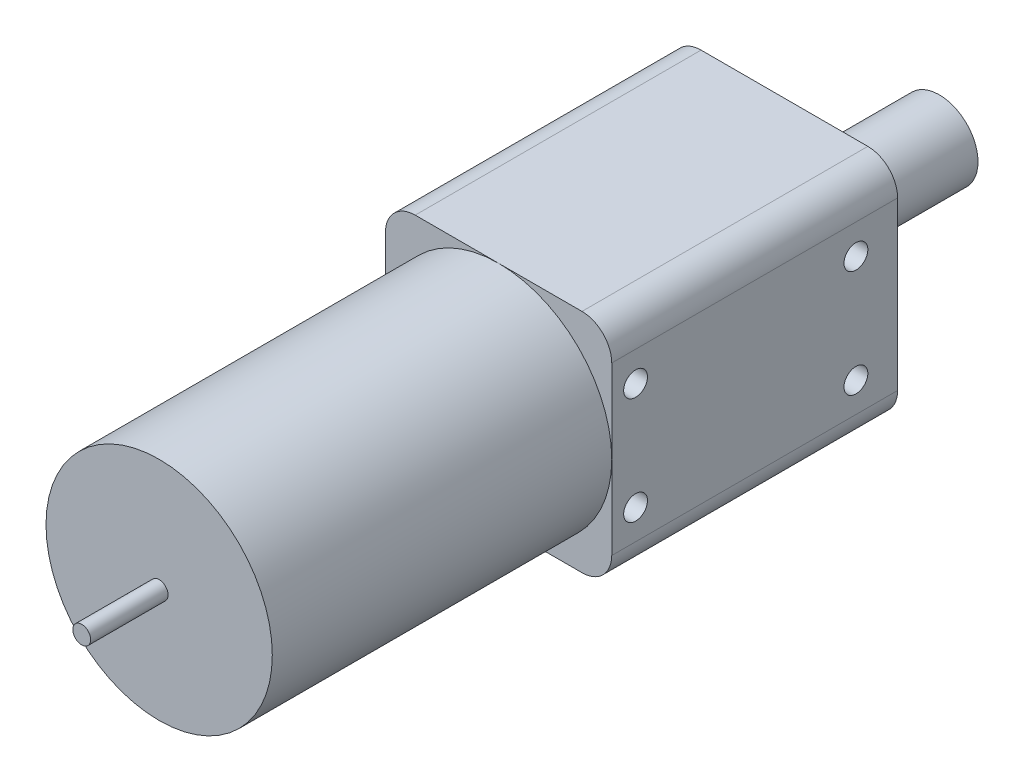
ISO-10303-21;
HEADER;
FILE_DESCRIPTION(('STEP AP214'),'2;1');
FILE_NAME('part.step','',(''),(''),'','','');
FILE_SCHEMA(('AUTOMOTIVE_DESIGN { 1 0 10303 214 1 1 1 1 }'));
ENDSEC;
DATA;
#1=APPLICATION_CONTEXT('core data for automotive mechanical design processes');
#2=APPLICATION_PROTOCOL_DEFINITION('international standard','automotive_design',2000,#1);
#3=PRODUCT_CONTEXT('',#1,'mechanical');
#4=PRODUCT('Part','Part','',(#3));
#5=PRODUCT_RELATED_PRODUCT_CATEGORY('part','',(#4));
#6=PRODUCT_DEFINITION_FORMATION('','',#4);
#7=PRODUCT_DEFINITION_CONTEXT('part definition',#1,'design');
#8=PRODUCT_DEFINITION('design','',#6,#7);
#9=PRODUCT_DEFINITION_SHAPE('','',#8);
#10=(LENGTH_UNIT() NAMED_UNIT(*) SI_UNIT(.MILLI.,.METRE.));
#11=(NAMED_UNIT(*) PLANE_ANGLE_UNIT() SI_UNIT($,.RADIAN.));
#12=(NAMED_UNIT(*) SI_UNIT($,.STERADIAN.) SOLID_ANGLE_UNIT());
#13=UNCERTAINTY_MEASURE_WITH_UNIT(LENGTH_MEASURE(1.E-05),#10,'distance_accuracy_value','');
#14=(GEOMETRIC_REPRESENTATION_CONTEXT(3) GLOBAL_UNCERTAINTY_ASSIGNED_CONTEXT((#13)) GLOBAL_UNIT_ASSIGNED_CONTEXT((#10,
#11,#12)) REPRESENTATION_CONTEXT('',''));
#15=CARTESIAN_POINT('',(0.,0.,0.));
#16=DIRECTION('',(0.,0.,1.));
#17=DIRECTION('',(1.,0.,0.));
#18=AXIS2_PLACEMENT_3D('',#15,#16,#17);
#19=CARTESIAN_POINT('',(0.,0.,57.));
#20=DIRECTION('',(0.,0.,1.));
#21=DIRECTION('',(1.,0.,0.));
#22=AXIS2_PLACEMENT_3D('',#19,#20,#21);
#23=PLANE('',#22);
#24=CARTESIAN_POINT('',(0.,0.,57.));
#25=DIRECTION('',(0.,0.,1.));
#26=DIRECTION('',(1.,0.,0.));
#27=AXIS2_PLACEMENT_3D('',#24,#25,#26);
#28=CIRCLE('',#27,19.);
#29=CARTESIAN_POINT('',(19.,0.,57.));
#30=VERTEX_POINT('',#29);
#31=EDGE_CURVE('E145',#30,#30,#28,.T.);
#32=ORIENTED_EDGE('',*,*,#31,.T.);
#33=EDGE_LOOP('',(#32));
#34=FACE_BOUND('',#33,.T.);
#35=CARTESIAN_POINT('',(0.,0.,57.));
#36=DIRECTION('',(0.,0.,1.));
#37=DIRECTION('',(1.,0.,0.));
#38=AXIS2_PLACEMENT_3D('',#35,#36,#37);
#39=CIRCLE('',#38,1.5);
#40=CARTESIAN_POINT('',(-1.5,0.,57.));
#41=VERTEX_POINT('',#40);
#42=EDGE_CURVE('E217',#41,#41,#39,.T.);
#43=ORIENTED_EDGE('',*,*,#42,.F.);
#44=EDGE_LOOP('',(#43));
#45=FACE_BOUND('',#44,.T.);
#46=ADVANCED_FACE('F32',(#34,#45),#23,.T.);
#47=CARTESIAN_POINT('',(0.,0.,-48.));
#48=DIRECTION('',(0.,0.,-1.));
#49=DIRECTION('',(-1.,0.,0.));
#50=AXIS2_PLACEMENT_3D('',#47,#48,#49);
#51=PLANE('',#50);
#52=DIRECTION('',(-1.,0.,0.));
#53=VECTOR('',#52,1.);
#54=CARTESIAN_POINT('',(19.,-19.,-48.));
#55=LINE('',#54,#53);
#56=CARTESIAN_POINT('',(14.,-19.,-48.));
#57=VERTEX_POINT('',#56);
#58=CARTESIAN_POINT('',(-14.,-19.,-48.));
#59=VERTEX_POINT('',#58);
#60=EDGE_CURVE('E191',#57,#59,#55,.T.);
#61=ORIENTED_EDGE('',*,*,#60,.T.);
#62=CARTESIAN_POINT('',(-14.,-14.,-48.));
#63=DIRECTION('',(0.,0.,-1.));
#64=DIRECTION('',(-1.,0.,0.));
#65=AXIS2_PLACEMENT_3D('',#62,#63,#64);
#66=CIRCLE('',#65,5.);
#67=CARTESIAN_POINT('',(-19.,-14.,-48.));
#68=VERTEX_POINT('',#67);
#69=EDGE_CURVE('E165',#59,#68,#66,.T.);
#70=ORIENTED_EDGE('',*,*,#69,.T.);
#71=DIRECTION('',(0.,1.,0.));
#72=VECTOR('',#71,1.);
#73=CARTESIAN_POINT('',(-19.,19.,-48.));
#74=LINE('',#73,#72);
#75=CARTESIAN_POINT('',(-19.,14.,-48.));
#76=VERTEX_POINT('',#75);
#77=EDGE_CURVE('E201',#68,#76,#74,.T.);
#78=ORIENTED_EDGE('',*,*,#77,.T.);
#79=CARTESIAN_POINT('',(-14.,14.,-48.));
#80=DIRECTION('',(0.,0.,-1.));
#81=DIRECTION('',(-1.,0.,0.));
#82=AXIS2_PLACEMENT_3D('',#79,#80,#81);
#83=CIRCLE('',#82,5.);
#84=CARTESIAN_POINT('',(-14.,19.,-48.));
#85=VERTEX_POINT('',#84);
#86=EDGE_CURVE('E163',#76,#85,#83,.T.);
#87=ORIENTED_EDGE('',*,*,#86,.T.);
#88=DIRECTION('',(1.,0.,0.));
#89=VECTOR('',#88,1.);
#90=CARTESIAN_POINT('',(19.,19.,-48.));
#91=LINE('',#90,#89);
#92=CARTESIAN_POINT('',(14.,19.,-48.));
#93=VERTEX_POINT('',#92);
#94=EDGE_CURVE('E192',#85,#93,#91,.T.);
#95=ORIENTED_EDGE('',*,*,#94,.T.);
#96=CARTESIAN_POINT('',(14.,14.,-48.));
#97=DIRECTION('',(0.,0.,-1.));
#98=DIRECTION('',(-1.,0.,0.));
#99=AXIS2_PLACEMENT_3D('',#96,#97,#98);
#100=CIRCLE('',#99,5.);
#101=CARTESIAN_POINT('',(19.,14.,-48.));
#102=VERTEX_POINT('',#101);
#103=EDGE_CURVE('E159',#93,#102,#100,.T.);
#104=ORIENTED_EDGE('',*,*,#103,.T.);
#105=DIRECTION('',(0.,-1.,0.));
#106=VECTOR('',#105,1.);
#107=CARTESIAN_POINT('',(19.,19.,-48.));
#108=LINE('',#107,#106);
#109=CARTESIAN_POINT('',(19.,-14.,-48.));
#110=VERTEX_POINT('',#109);
#111=EDGE_CURVE('E180',#102,#110,#108,.T.);
#112=ORIENTED_EDGE('',*,*,#111,.T.);
#113=CARTESIAN_POINT('',(14.,-14.,-48.));
#114=DIRECTION('',(0.,0.,-1.));
#115=DIRECTION('',(-1.,0.,0.));
#116=AXIS2_PLACEMENT_3D('',#113,#114,#115);
#117=CIRCLE('',#116,5.);
#118=EDGE_CURVE('E161',#110,#57,#117,.T.);
#119=ORIENTED_EDGE('',*,*,#118,.T.);
#120=EDGE_LOOP('',(#61,#70,#78,#87,#95,#104,#112,#119));
#121=FACE_BOUND('',#120,.T.);
#122=CARTESIAN_POINT('',(0.,0.,-48.));
#123=DIRECTION('',(0.,0.,-1.));
#124=DIRECTION('',(-1.,0.,0.));
#125=AXIS2_PLACEMENT_3D('',#122,#123,#124);
#126=CIRCLE('',#125,6.5);
#127=CARTESIAN_POINT('',(6.5,0.,-48.));
#128=VERTEX_POINT('',#127);
#129=EDGE_CURVE('E211',#128,#128,#126,.T.);
#130=ORIENTED_EDGE('',*,*,#129,.F.);
#131=EDGE_LOOP('',(#130));
#132=FACE_BOUND('',#131,.T.);
#133=ADVANCED_FACE('F186',(#121,#132),#51,.T.);
#134=CARTESIAN_POINT('',(0.,0.,57.));
#135=DIRECTION('',(0.,0.,-1.));
#136=DIRECTION('',(-1.,0.,0.));
#137=AXIS2_PLACEMENT_3D('',#134,#135,#136);
#138=CYLINDRICAL_SURFACE('',#137,19.);
#139=ORIENTED_EDGE('',*,*,#31,.F.);
#140=EDGE_LOOP('',(#139));
#141=FACE_BOUND('',#140,.T.);
#142=CARTESIAN_POINT('',(0.,0.,0.));
#143=DIRECTION('',(0.,0.,1.));
#144=DIRECTION('',(1.,0.,0.));
#145=AXIS2_PLACEMENT_3D('',#142,#143,#144);
#146=CIRCLE('',#145,19.);
#147=CARTESIAN_POINT('',(19.,0.,0.));
#148=VERTEX_POINT('',#147);
#149=CARTESIAN_POINT('',(0.,19.,0.));
#150=VERTEX_POINT('',#149);
#151=EDGE_CURVE('E144',#148,#150,#146,.T.);
#152=ORIENTED_EDGE('',*,*,#151,.T.);
#153=CARTESIAN_POINT('',(-19.,0.,0.));
#154=VERTEX_POINT('',#153);
#155=EDGE_CURVE('E131',#150,#154,#146,.T.);
#156=ORIENTED_EDGE('',*,*,#155,.T.);
#157=CARTESIAN_POINT('',(0.,-19.,0.));
#158=VERTEX_POINT('',#157);
#159=EDGE_CURVE('E124',#154,#158,#146,.T.);
#160=ORIENTED_EDGE('',*,*,#159,.T.);
#161=EDGE_CURVE('E132',#158,#148,#146,.T.);
#162=ORIENTED_EDGE('',*,*,#161,.T.);
#163=EDGE_LOOP('',(#152,#156,#160,#162));
#164=FACE_BOUND('',#163,.T.);
#165=ADVANCED_FACE('F142',(#141,#164),#138,.T.);
#166=CARTESIAN_POINT('',(0.,0.,0.));
#167=DIRECTION('',(0.,0.,-1.));
#168=DIRECTION('',(-1.,0.,0.));
#169=AXIS2_PLACEMENT_3D('',#166,#167,#168);
#170=PLANE('',#169);
#171=DIRECTION('',(0.,-1.,0.));
#172=VECTOR('',#171,1.);
#173=CARTESIAN_POINT('',(19.,19.,0.));
#174=LINE('',#173,#172);
#175=CARTESIAN_POINT('',(19.,14.,0.));
#176=VERTEX_POINT('',#175);
#177=EDGE_CURVE('E204',#176,#148,#174,.T.);
#178=ORIENTED_EDGE('',*,*,#177,.F.);
#179=CARTESIAN_POINT('',(14.,14.,0.));
#180=DIRECTION('',(0.,0.,-1.));
#181=DIRECTION('',(-1.,0.,0.));
#182=AXIS2_PLACEMENT_3D('',#179,#180,#181);
#183=CIRCLE('',#182,5.);
#184=CARTESIAN_POINT('',(14.,19.,0.));
#185=VERTEX_POINT('',#184);
#186=EDGE_CURVE('E11',#176,#185,#183,.F.);
#187=ORIENTED_EDGE('',*,*,#186,.T.);
#188=DIRECTION('',(1.,0.,0.));
#189=VECTOR('',#188,1.);
#190=CARTESIAN_POINT('',(19.,19.,0.));
#191=LINE('',#190,#189);
#192=EDGE_CURVE('E120',#150,#185,#191,.T.);
#193=ORIENTED_EDGE('',*,*,#192,.F.);
#194=ORIENTED_EDGE('',*,*,#151,.F.);
#195=EDGE_LOOP('',(#178,#187,#193,#194));
#196=FACE_BOUND('',#195,.T.);
#197=ADVANCED_FACE('F321',(#196),#170,.F.);
#198=CARTESIAN_POINT('',(-14.,19.,0.));
#199=VERTEX_POINT('',#198);
#200=EDGE_CURVE('E207',#199,#150,#191,.T.);
#201=ORIENTED_EDGE('',*,*,#200,.F.);
#202=CARTESIAN_POINT('',(-14.,14.,0.));
#203=DIRECTION('',(0.,0.,-1.));
#204=DIRECTION('',(-1.,0.,0.));
#205=AXIS2_PLACEMENT_3D('',#202,#203,#204);
#206=CIRCLE('',#205,5.);
#207=CARTESIAN_POINT('',(-19.,14.,0.));
#208=VERTEX_POINT('',#207);
#209=EDGE_CURVE('E139',#199,#208,#206,.F.);
#210=ORIENTED_EDGE('',*,*,#209,.T.);
#211=DIRECTION('',(0.,1.,0.));
#212=VECTOR('',#211,1.);
#213=CARTESIAN_POINT('',(-19.,19.,0.));
#214=LINE('',#213,#212);
#215=EDGE_CURVE('E115',#154,#208,#214,.T.);
#216=ORIENTED_EDGE('',*,*,#215,.F.);
#217=ORIENTED_EDGE('',*,*,#155,.F.);
#218=EDGE_LOOP('',(#201,#210,#216,#217));
#219=FACE_BOUND('',#218,.T.);
#220=ADVANCED_FACE('F137',(#219),#170,.F.);
#221=CARTESIAN_POINT('',(-19.,-14.,0.));
#222=VERTEX_POINT('',#221);
#223=EDGE_CURVE('E110',#222,#154,#214,.T.);
#224=ORIENTED_EDGE('',*,*,#223,.F.);
#225=CARTESIAN_POINT('',(-14.,-14.,0.));
#226=DIRECTION('',(0.,0.,-1.));
#227=DIRECTION('',(-1.,0.,0.));
#228=AXIS2_PLACEMENT_3D('',#225,#226,#227);
#229=CIRCLE('',#228,5.);
#230=CARTESIAN_POINT('',(-14.,-19.,0.));
#231=VERTEX_POINT('',#230);
#232=EDGE_CURVE('E152',#222,#231,#229,.F.);
#233=ORIENTED_EDGE('',*,*,#232,.T.);
#234=DIRECTION('',(-1.,0.,0.));
#235=VECTOR('',#234,1.);
#236=CARTESIAN_POINT('',(19.,-19.,0.));
#237=LINE('',#236,#235);
#238=EDGE_CURVE('E127',#158,#231,#237,.T.);
#239=ORIENTED_EDGE('',*,*,#238,.F.);
#240=ORIENTED_EDGE('',*,*,#159,.F.);
#241=EDGE_LOOP('',(#224,#233,#239,#240));
#242=FACE_BOUND('',#241,.T.);
#243=ADVANCED_FACE('F125',(#242),#170,.F.);
#244=CARTESIAN_POINT('',(-19.,19.,-48.));
#245=DIRECTION('',(1.,0.,0.));
#246=DIRECTION('',(0.,0.,-1.));
#247=AXIS2_PLACEMENT_3D('',#244,#245,#246);
#248=PLANE('',#247);
#249=CARTESIAN_POINT('',(-19.,9.,-41.));
#250=DIRECTION('',(-1.,0.,0.));
#251=DIRECTION('',(0.,0.,1.));
#252=AXIS2_PLACEMENT_3D('',#249,#250,#251);
#253=CIRCLE('',#252,2.);
#254=CARTESIAN_POINT('',(-19.,9.,-39.));
#255=VERTEX_POINT('',#254);
#256=EDGE_CURVE('E241',#255,#255,#253,.T.);
#257=ORIENTED_EDGE('',*,*,#256,.F.);
#258=EDGE_LOOP('',(#257));
#259=FACE_BOUND('',#258,.T.);
#260=CARTESIAN_POINT('',(-19.,-9.,-41.));
#261=DIRECTION('',(-1.,0.,0.));
#262=DIRECTION('',(0.,0.,1.));
#263=AXIS2_PLACEMENT_3D('',#260,#261,#262);
#264=CIRCLE('',#263,2.);
#265=CARTESIAN_POINT('',(-19.,-9.,-39.));
#266=VERTEX_POINT('',#265);
#267=EDGE_CURVE('E235',#266,#266,#264,.T.);
#268=ORIENTED_EDGE('',*,*,#267,.F.);
#269=EDGE_LOOP('',(#268));
#270=FACE_BOUND('',#269,.T.);
#271=CARTESIAN_POINT('',(-19.,-9.,-4.));
#272=DIRECTION('',(-1.,0.,0.));
#273=DIRECTION('',(0.,0.,1.));
#274=AXIS2_PLACEMENT_3D('',#271,#272,#273);
#275=CIRCLE('',#274,2.);
#276=CARTESIAN_POINT('',(-19.,-9.,-2.));
#277=VERTEX_POINT('',#276);
#278=EDGE_CURVE('E229',#277,#277,#275,.T.);
#279=ORIENTED_EDGE('',*,*,#278,.F.);
#280=EDGE_LOOP('',(#279));
#281=FACE_BOUND('',#280,.T.);
#282=CARTESIAN_POINT('',(-19.,9.,-4.));
#283=DIRECTION('',(-1.,0.,0.));
#284=DIRECTION('',(0.,0.,1.));
#285=AXIS2_PLACEMENT_3D('',#282,#283,#284);
#286=CIRCLE('',#285,2.);
#287=CARTESIAN_POINT('',(-19.,9.,-2.));
#288=VERTEX_POINT('',#287);
#289=EDGE_CURVE('E223',#288,#288,#286,.T.);
#290=ORIENTED_EDGE('',*,*,#289,.F.);
#291=EDGE_LOOP('',(#290));
#292=FACE_BOUND('',#291,.T.);
#293=ORIENTED_EDGE('',*,*,#77,.F.);
#294=DIRECTION('',(0.,0.,1.));
#295=VECTOR('',#294,1.);
#296=CARTESIAN_POINT('',(-19.,-14.,-48.));
#297=LINE('',#296,#295);
#298=EDGE_CURVE('E118',#68,#222,#297,.T.);
#299=ORIENTED_EDGE('',*,*,#298,.T.);
#300=ORIENTED_EDGE('',*,*,#223,.T.);
#301=ORIENTED_EDGE('',*,*,#215,.T.);
#302=DIRECTION('',(0.,0.,1.));
#303=VECTOR('',#302,1.);
#304=CARTESIAN_POINT('',(-19.,14.,-48.));
#305=LINE('',#304,#303);
#306=EDGE_CURVE('E149',#208,#76,#305,.F.);
#307=ORIENTED_EDGE('',*,*,#306,.T.);
#308=EDGE_LOOP('',(#293,#299,#300,#301,#307));
#309=FACE_BOUND('',#308,.T.);
#310=ADVANCED_FACE('F113',(#259,#270,#281,#292,#309),#248,.F.);
#311=CARTESIAN_POINT('',(19.,19.,-48.));
#312=DIRECTION('',(0.,-1.,0.));
#313=DIRECTION('',(0.,0.,-1.));
#314=AXIS2_PLACEMENT_3D('',#311,#312,#313);
#315=PLANE('',#314);
#316=ORIENTED_EDGE('',*,*,#94,.F.);
#317=DIRECTION('',(0.,0.,1.));
#318=VECTOR('',#317,1.);
#319=CARTESIAN_POINT('',(-14.,19.,-48.));
#320=LINE('',#319,#318);
#321=EDGE_CURVE('E169',#85,#199,#320,.T.);
#322=ORIENTED_EDGE('',*,*,#321,.T.);
#323=ORIENTED_EDGE('',*,*,#200,.T.);
#324=ORIENTED_EDGE('',*,*,#192,.T.);
#325=DIRECTION('',(0.,0.,1.));
#326=VECTOR('',#325,1.);
#327=CARTESIAN_POINT('',(14.,19.,-48.));
#328=LINE('',#327,#326);
#329=EDGE_CURVE('E167',#185,#93,#328,.F.);
#330=ORIENTED_EDGE('',*,*,#329,.T.);
#331=EDGE_LOOP('',(#316,#322,#323,#324,#330));
#332=FACE_BOUND('',#331,.T.);
#333=ADVANCED_FACE('F282',(#332),#315,.F.);
#334=CARTESIAN_POINT('',(19.,19.,-48.));
#335=DIRECTION('',(-1.,0.,0.));
#336=DIRECTION('',(0.,0.,1.));
#337=AXIS2_PLACEMENT_3D('',#334,#335,#336);
#338=PLANE('',#337);
#339=CARTESIAN_POINT('',(19.,9.,-4.));
#340=DIRECTION('',(1.,0.,0.));
#341=DIRECTION('',(0.,0.,-1.));
#342=AXIS2_PLACEMENT_3D('',#339,#340,#341);
#343=CIRCLE('',#342,2.);
#344=CARTESIAN_POINT('',(19.,9.,-6.));
#345=VERTEX_POINT('',#344);
#346=EDGE_CURVE('E265',#345,#345,#343,.T.);
#347=ORIENTED_EDGE('',*,*,#346,.F.);
#348=EDGE_LOOP('',(#347));
#349=FACE_BOUND('',#348,.T.);
#350=CARTESIAN_POINT('',(19.,-9.,-4.));
#351=DIRECTION('',(1.,0.,0.));
#352=DIRECTION('',(0.,0.,-1.));
#353=AXIS2_PLACEMENT_3D('',#350,#351,#352);
#354=CIRCLE('',#353,2.);
#355=CARTESIAN_POINT('',(19.,-9.,-6.));
#356=VERTEX_POINT('',#355);
#357=EDGE_CURVE('E259',#356,#356,#354,.T.);
#358=ORIENTED_EDGE('',*,*,#357,.F.);
#359=EDGE_LOOP('',(#358));
#360=FACE_BOUND('',#359,.T.);
#361=CARTESIAN_POINT('',(19.,-9.,-41.));
#362=DIRECTION('',(1.,0.,0.));
#363=DIRECTION('',(0.,0.,-1.));
#364=AXIS2_PLACEMENT_3D('',#361,#362,#363);
#365=CIRCLE('',#364,2.);
#366=CARTESIAN_POINT('',(19.,-9.,-43.));
#367=VERTEX_POINT('',#366);
#368=EDGE_CURVE('E253',#367,#367,#365,.T.);
#369=ORIENTED_EDGE('',*,*,#368,.F.);
#370=EDGE_LOOP('',(#369));
#371=FACE_BOUND('',#370,.T.);
#372=CARTESIAN_POINT('',(19.,9.,-41.));
#373=DIRECTION('',(1.,0.,0.));
#374=DIRECTION('',(0.,0.,-1.));
#375=AXIS2_PLACEMENT_3D('',#372,#373,#374);
#376=CIRCLE('',#375,2.);
#377=CARTESIAN_POINT('',(19.,9.,-43.));
#378=VERTEX_POINT('',#377);
#379=EDGE_CURVE('E247',#378,#378,#376,.T.);
#380=ORIENTED_EDGE('',*,*,#379,.F.);
#381=EDGE_LOOP('',(#380));
#382=FACE_BOUND('',#381,.T.);
#383=CARTESIAN_POINT('',(19.,-14.,0.));
#384=VERTEX_POINT('',#383);
#385=EDGE_CURVE('E181',#148,#384,#174,.T.);
#386=ORIENTED_EDGE('',*,*,#385,.T.);
#387=DIRECTION('',(0.,0.,1.));
#388=VECTOR('',#387,1.);
#389=CARTESIAN_POINT('',(19.,-14.,-48.));
#390=LINE('',#389,#388);
#391=EDGE_CURVE('E40',#384,#110,#390,.F.);
#392=ORIENTED_EDGE('',*,*,#391,.T.);
#393=ORIENTED_EDGE('',*,*,#111,.F.);
#394=DIRECTION('',(0.,0.,1.));
#395=VECTOR('',#394,1.);
#396=CARTESIAN_POINT('',(19.,14.,-48.));
#397=LINE('',#396,#395);
#398=EDGE_CURVE('E174',#102,#176,#397,.T.);
#399=ORIENTED_EDGE('',*,*,#398,.T.);
#400=ORIENTED_EDGE('',*,*,#177,.T.);
#401=EDGE_LOOP('',(#386,#392,#393,#399,#400));
#402=FACE_BOUND('',#401,.T.);
#403=ADVANCED_FACE('F179',(#349,#360,#371,#382,#402),#338,.F.);
#404=CARTESIAN_POINT('',(19.,-19.,-48.));
#405=DIRECTION('',(0.,1.,0.));
#406=DIRECTION('',(0.,0.,1.));
#407=AXIS2_PLACEMENT_3D('',#404,#405,#406);
#408=PLANE('',#407);
#409=ORIENTED_EDGE('',*,*,#238,.T.);
#410=DIRECTION('',(0.,0.,1.));
#411=VECTOR('',#410,1.);
#412=CARTESIAN_POINT('',(-14.,-19.,-48.));
#413=LINE('',#412,#411);
#414=EDGE_CURVE('E157',#231,#59,#413,.F.);
#415=ORIENTED_EDGE('',*,*,#414,.T.);
#416=ORIENTED_EDGE('',*,*,#60,.F.);
#417=DIRECTION('',(0.,0.,1.));
#418=VECTOR('',#417,1.);
#419=CARTESIAN_POINT('',(14.,-19.,-48.));
#420=LINE('',#419,#418);
#421=CARTESIAN_POINT('',(14.,-19.,0.));
#422=VERTEX_POINT('',#421);
#423=EDGE_CURVE('E154',#57,#422,#420,.T.);
#424=ORIENTED_EDGE('',*,*,#423,.T.);
#425=EDGE_CURVE('E198',#422,#158,#237,.T.);
#426=ORIENTED_EDGE('',*,*,#425,.T.);
#427=EDGE_LOOP('',(#409,#415,#416,#424,#426));
#428=FACE_BOUND('',#427,.T.);
#429=ADVANCED_FACE('F197',(#428),#408,.F.);
#430=ORIENTED_EDGE('',*,*,#425,.F.);
#431=CARTESIAN_POINT('',(14.,-14.,0.));
#432=DIRECTION('',(0.,0.,-1.));
#433=DIRECTION('',(-1.,0.,0.));
#434=AXIS2_PLACEMENT_3D('',#431,#432,#433);
#435=CIRCLE('',#434,5.);
#436=EDGE_CURVE('E53',#422,#384,#435,.F.);
#437=ORIENTED_EDGE('',*,*,#436,.T.);
#438=ORIENTED_EDGE('',*,*,#385,.F.);
#439=ORIENTED_EDGE('',*,*,#161,.F.);
#440=EDGE_LOOP('',(#430,#437,#438,#439));
#441=FACE_BOUND('',#440,.T.);
#442=ADVANCED_FACE('F200',(#441),#170,.F.);
#443=CARTESIAN_POINT('',(0.,0.,-74.));
#444=DIRECTION('',(0.,0.,1.));
#445=DIRECTION('',(1.,0.,0.));
#446=AXIS2_PLACEMENT_3D('',#443,#444,#445);
#447=CYLINDRICAL_SURFACE('',#446,6.5);
#448=CARTESIAN_POINT('',(0.,0.,-74.));
#449=DIRECTION('',(0.,0.,-1.));
#450=DIRECTION('',(-1.,0.,0.));
#451=AXIS2_PLACEMENT_3D('',#448,#449,#450);
#452=CIRCLE('',#451,6.5);
#453=CARTESIAN_POINT('',(6.5,0.,-74.));
#454=VERTEX_POINT('',#453);
#455=EDGE_CURVE('E140',#454,#454,#452,.T.);
#456=CARTESIAN_POINT('',(6.5,0.,-74.));
#457=CARTESIAN_POINT('',(6.5,0.,-73.7291666666667));
#458=CARTESIAN_POINT('',(6.5,0.,-73.4583333333333));
#459=CARTESIAN_POINT('',(6.5,0.,-72.9166666666667));
#460=CARTESIAN_POINT('',(6.5,0.,-72.6458333333333));
#461=CARTESIAN_POINT('',(6.5,0.,-72.1041666666667));
#462=CARTESIAN_POINT('',(6.5,0.,-71.8333333333333));
#463=CARTESIAN_POINT('',(6.5,0.,-71.2916666666667));
#464=CARTESIAN_POINT('',(6.5,0.,-71.0208333333333));
#465=CARTESIAN_POINT('',(6.5,0.,-70.4791666666667));
#466=CARTESIAN_POINT('',(6.5,0.,-70.2083333333333));
#467=CARTESIAN_POINT('',(6.5,0.,-69.6666666666667));
#468=CARTESIAN_POINT('',(6.5,0.,-69.3958333333333));
#469=CARTESIAN_POINT('',(6.5,0.,-68.8541666666667));
#470=CARTESIAN_POINT('',(6.5,0.,-68.5833333333333));
#471=CARTESIAN_POINT('',(6.5,0.,-68.0416666666667));
#472=CARTESIAN_POINT('',(6.5,0.,-67.7708333333333));
#473=CARTESIAN_POINT('',(6.5,0.,-67.2291666666667));
#474=CARTESIAN_POINT('',(6.5,0.,-66.9583333333333));
#475=CARTESIAN_POINT('',(6.5,0.,-66.4166666666667));
#476=CARTESIAN_POINT('',(6.5,0.,-66.1458333333333));
#477=CARTESIAN_POINT('',(6.5,0.,-65.6041666666667));
#478=CARTESIAN_POINT('',(6.5,0.,-65.3333333333333));
#479=CARTESIAN_POINT('',(6.5,0.,-64.7916666666667));
#480=CARTESIAN_POINT('',(6.5,0.,-64.5208333333333));
#481=CARTESIAN_POINT('',(6.5,0.,-63.9791666666667));
#482=CARTESIAN_POINT('',(6.5,0.,-63.7083333333333));
#483=CARTESIAN_POINT('',(6.5,0.,-63.1666666666667));
#484=CARTESIAN_POINT('',(6.5,0.,-62.8958333333333));
#485=CARTESIAN_POINT('',(6.5,0.,-62.3541666666667));
#486=CARTESIAN_POINT('',(6.5,0.,-62.0833333333333));
#487=CARTESIAN_POINT('',(6.5,0.,-61.5416666666667));
#488=CARTESIAN_POINT('',(6.5,0.,-61.2708333333333));
#489=CARTESIAN_POINT('',(6.5,0.,-60.7291666666667));
#490=CARTESIAN_POINT('',(6.5,0.,-60.4583333333333));
#491=CARTESIAN_POINT('',(6.5,0.,-59.9166666666667));
#492=CARTESIAN_POINT('',(6.5,0.,-59.6458333333333));
#493=CARTESIAN_POINT('',(6.5,0.,-59.1041666666667));
#494=CARTESIAN_POINT('',(6.5,0.,-58.8333333333333));
#495=CARTESIAN_POINT('',(6.5,0.,-58.2916666666667));
#496=CARTESIAN_POINT('',(6.5,0.,-58.0208333333333));
#497=CARTESIAN_POINT('',(6.5,0.,-57.4791666666667));
#498=CARTESIAN_POINT('',(6.5,0.,-57.2083333333333));
#499=CARTESIAN_POINT('',(6.5,0.,-56.6666666666667));
#500=CARTESIAN_POINT('',(6.5,0.,-56.3958333333333));
#501=CARTESIAN_POINT('',(6.5,0.,-55.8541666666667));
#502=CARTESIAN_POINT('',(6.5,0.,-55.5833333333333));
#503=CARTESIAN_POINT('',(6.5,0.,-55.0416666666667));
#504=CARTESIAN_POINT('',(6.5,0.,-54.7708333333333));
#505=CARTESIAN_POINT('',(6.5,0.,-54.2291666666667));
#506=CARTESIAN_POINT('',(6.5,0.,-53.9583333333333));
#507=CARTESIAN_POINT('',(6.5,0.,-53.4166666666667));
#508=CARTESIAN_POINT('',(6.5,0.,-53.1458333333333));
#509=CARTESIAN_POINT('',(6.5,0.,-52.6041666666667));
#510=CARTESIAN_POINT('',(6.5,0.,-52.3333333333333));
#511=CARTESIAN_POINT('',(6.5,0.,-51.7916666666667));
#512=CARTESIAN_POINT('',(6.5,0.,-51.5208333333333));
#513=CARTESIAN_POINT('',(6.5,0.,-50.9791666666667));
#514=CARTESIAN_POINT('',(6.5,0.,-50.7083333333333));
#515=CARTESIAN_POINT('',(6.5,0.,-50.1666666666667));
#516=CARTESIAN_POINT('',(6.5,0.,-49.8958333333333));
#517=CARTESIAN_POINT('',(6.5,0.,-49.3541666666667));
#518=CARTESIAN_POINT('',(6.5,0.,-49.0833333333333));
#519=CARTESIAN_POINT('',(6.5,0.,-48.5416666666667));
#520=CARTESIAN_POINT('',(6.5,0.,-48.2708333333333));
#521=CARTESIAN_POINT('',(6.5,0.,-48.));
#522=B_SPLINE_CURVE_WITH_KNOTS('',3,(#456,#457,#458,#459,#460,#461,#462,#463,#464,#465,#466,
#467,#468,#469,#470,#471,#472,#473,#474,#475,#476,#477,#478,#479,#480,#481,#482,#483,#484,#485,
#486,#487,#488,#489,#490,#491,#492,#493,#494,#495,#496,#497,#498,#499,#500,#501,#502,#503,#504,
#505,#506,#507,#508,#509,#510,#511,#512,#513,#514,#515,#516,#517,#518,#519,#520,#521),
.UNSPECIFIED.,.F.,.F.,(4,2,2,2,2,2,2,2,2,2,2,2,2,2,2,2,2,2,2,2,2,2,2,2,2,2,2,2,2,2,2,2,4),(0.,
0.812500000000008,1.625,2.43750000000001,3.25,4.06250000000001,4.875,5.6875,6.50000000000001,
7.3125,8.12500000000001,8.9375,9.75000000000001,10.5625,11.375,12.1875,13.,13.8125,14.625,
15.4375,16.25,17.0625,17.875,18.6875,19.5,20.3125,21.125,21.9375,22.75,23.5625,24.375,25.1875,
26.),.UNSPECIFIED.);
#523=EDGE_CURVE('BSEAM360',#454,#128,#522,.T.);
#524=ORIENTED_EDGE('',*,*,#455,.F.);
#525=ORIENTED_EDGE('',*,*,#129,.T.);
#526=ORIENTED_EDGE('',*,*,#523,.T.);
#527=ORIENTED_EDGE('',*,*,#523,.F.);
#528=EDGE_LOOP('',(#524,#526,#525,#527));
#529=FACE_BOUND('',#528,.T.);
#530=ADVANCED_FACE('F360',(#529),#447,.T.);
#531=CARTESIAN_POINT('',(0.,0.,-74.));
#532=DIRECTION('',(0.,0.,-1.));
#533=DIRECTION('',(-1.,0.,0.));
#534=AXIS2_PLACEMENT_3D('',#531,#532,#533);
#535=PLANE('',#534);
#536=ORIENTED_EDGE('',*,*,#455,.T.);
#537=EDGE_LOOP('',(#536));
#538=FACE_BOUND('',#537,.T.);
#539=ADVANCED_FACE('F364',(#538),#535,.T.);
#540=CARTESIAN_POINT('',(0.,0.,70.));
#541=DIRECTION('',(0.,0.,-1.));
#542=DIRECTION('',(-1.,0.,0.));
#543=AXIS2_PLACEMENT_3D('',#540,#541,#542);
#544=CYLINDRICAL_SURFACE('',#543,1.5);
#545=CARTESIAN_POINT('',(0.,0.,70.));
#546=DIRECTION('',(0.,0.,1.));
#547=DIRECTION('',(1.,0.,0.));
#548=AXIS2_PLACEMENT_3D('',#545,#546,#547);
#549=CIRCLE('',#548,1.5);
#550=CARTESIAN_POINT('',(-1.5,0.,70.));
#551=VERTEX_POINT('',#550);
#552=EDGE_CURVE('E214',#551,#551,#549,.T.);
#553=CARTESIAN_POINT('',(-1.5,0.,70.));
#554=CARTESIAN_POINT('',(-1.5,0.,69.8645833333333));
#555=CARTESIAN_POINT('',(-1.5,0.,69.7291666666667));
#556=CARTESIAN_POINT('',(-1.5,0.,69.4583333333333));
#557=CARTESIAN_POINT('',(-1.5,0.,69.3229166666667));
#558=CARTESIAN_POINT('',(-1.5,0.,69.0520833333333));
#559=CARTESIAN_POINT('',(-1.5,0.,68.9166666666667));
#560=CARTESIAN_POINT('',(-1.5,0.,68.6458333333333));
#561=CARTESIAN_POINT('',(-1.5,0.,68.5104166666667));
#562=CARTESIAN_POINT('',(-1.5,0.,68.2395833333333));
#563=CARTESIAN_POINT('',(-1.5,0.,68.1041666666667));
#564=CARTESIAN_POINT('',(-1.5,0.,67.8333333333333));
#565=CARTESIAN_POINT('',(-1.5,0.,67.6979166666667));
#566=CARTESIAN_POINT('',(-1.5,0.,67.4270833333333));
#567=CARTESIAN_POINT('',(-1.5,0.,67.2916666666667));
#568=CARTESIAN_POINT('',(-1.5,0.,67.0208333333333));
#569=CARTESIAN_POINT('',(-1.5,0.,66.8854166666667));
#570=CARTESIAN_POINT('',(-1.5,0.,66.6145833333333));
#571=CARTESIAN_POINT('',(-1.5,0.,66.4791666666667));
#572=CARTESIAN_POINT('',(-1.5,0.,66.2083333333333));
#573=CARTESIAN_POINT('',(-1.5,0.,66.0729166666667));
#574=CARTESIAN_POINT('',(-1.5,0.,65.8020833333333));
#575=CARTESIAN_POINT('',(-1.5,0.,65.6666666666667));
#576=CARTESIAN_POINT('',(-1.5,0.,65.3958333333333));
#577=CARTESIAN_POINT('',(-1.5,0.,65.2604166666667));
#578=CARTESIAN_POINT('',(-1.5,0.,64.9895833333333));
#579=CARTESIAN_POINT('',(-1.5,0.,64.8541666666667));
#580=CARTESIAN_POINT('',(-1.5,0.,64.5833333333333));
#581=CARTESIAN_POINT('',(-1.5,0.,64.4479166666667));
#582=CARTESIAN_POINT('',(-1.5,0.,64.1770833333333));
#583=CARTESIAN_POINT('',(-1.5,0.,64.0416666666667));
#584=CARTESIAN_POINT('',(-1.5,0.,63.7708333333333));
#585=CARTESIAN_POINT('',(-1.5,0.,63.6354166666667));
#586=CARTESIAN_POINT('',(-1.5,0.,63.3645833333333));
#587=CARTESIAN_POINT('',(-1.5,0.,63.2291666666667));
#588=CARTESIAN_POINT('',(-1.5,0.,62.9583333333333));
#589=CARTESIAN_POINT('',(-1.5,0.,62.8229166666667));
#590=CARTESIAN_POINT('',(-1.5,0.,62.5520833333333));
#591=CARTESIAN_POINT('',(-1.5,0.,62.4166666666667));
#592=CARTESIAN_POINT('',(-1.5,0.,62.1458333333333));
#593=CARTESIAN_POINT('',(-1.5,0.,62.0104166666667));
#594=CARTESIAN_POINT('',(-1.5,0.,61.7395833333333));
#595=CARTESIAN_POINT('',(-1.5,0.,61.6041666666667));
#596=CARTESIAN_POINT('',(-1.5,0.,61.3333333333333));
#597=CARTESIAN_POINT('',(-1.5,0.,61.1979166666667));
#598=CARTESIAN_POINT('',(-1.5,0.,60.9270833333333));
#599=CARTESIAN_POINT('',(-1.5,0.,60.7916666666667));
#600=CARTESIAN_POINT('',(-1.5,0.,60.5208333333333));
#601=CARTESIAN_POINT('',(-1.5,0.,60.3854166666667));
#602=CARTESIAN_POINT('',(-1.5,0.,60.1145833333333));
#603=CARTESIAN_POINT('',(-1.5,0.,59.9791666666667));
#604=CARTESIAN_POINT('',(-1.5,0.,59.7083333333333));
#605=CARTESIAN_POINT('',(-1.5,0.,59.5729166666667));
#606=CARTESIAN_POINT('',(-1.5,0.,59.3020833333333));
#607=CARTESIAN_POINT('',(-1.5,0.,59.1666666666667));
#608=CARTESIAN_POINT('',(-1.5,0.,58.8958333333333));
#609=CARTESIAN_POINT('',(-1.5,0.,58.7604166666667));
#610=CARTESIAN_POINT('',(-1.5,0.,58.4895833333333));
#611=CARTESIAN_POINT('',(-1.5,0.,58.3541666666667));
#612=CARTESIAN_POINT('',(-1.5,0.,58.0833333333333));
#613=CARTESIAN_POINT('',(-1.5,0.,57.9479166666667));
#614=CARTESIAN_POINT('',(-1.5,0.,57.6770833333333));
#615=CARTESIAN_POINT('',(-1.5,0.,57.5416666666667));
#616=CARTESIAN_POINT('',(-1.5,0.,57.2708333333333));
#617=CARTESIAN_POINT('',(-1.5,0.,57.1354166666667));
#618=CARTESIAN_POINT('',(-1.5,0.,57.));
#619=B_SPLINE_CURVE_WITH_KNOTS('',3,(#553,#554,#555,#556,#557,#558,#559,#560,#561,#562,#563,
#564,#565,#566,#567,#568,#569,#570,#571,#572,#573,#574,#575,#576,#577,#578,#579,#580,#581,#582,
#583,#584,#585,#586,#587,#588,#589,#590,#591,#592,#593,#594,#595,#596,#597,#598,#599,#600,#601,
#602,#603,#604,#605,#606,#607,#608,#609,#610,#611,#612,#613,#614,#615,#616,#617,#618),
.UNSPECIFIED.,.F.,.F.,(4,2,2,2,2,2,2,2,2,2,2,2,2,2,2,2,2,2,2,2,2,2,2,2,2,2,2,2,2,2,2,2,4),(0.,
0.406249999999997,0.812499999999994,1.21874999999999,1.62499999999999,2.03125,2.4375,
2.84374999999999,3.24999999999999,3.65624999999999,4.0625,4.46874999999999,4.87499999999999,
5.28124999999999,5.6875,6.09374999999999,6.49999999999999,6.90624999999999,7.31249999999999,
7.71875,8.12499999999999,8.53124999999999,8.93749999999999,9.34374999999999,9.74999999999999,
10.15625,10.5625,10.96875,11.375,11.78125,12.1875,12.59375,13.),.UNSPECIFIED.);
#620=EDGE_CURVE('BSEAM368',#551,#41,#619,.T.);
#621=ORIENTED_EDGE('',*,*,#552,.F.);
#622=ORIENTED_EDGE('',*,*,#42,.T.);
#623=ORIENTED_EDGE('',*,*,#620,.T.);
#624=ORIENTED_EDGE('',*,*,#620,.F.);
#625=EDGE_LOOP('',(#621,#623,#622,#624));
#626=FACE_BOUND('',#625,.T.);
#627=ADVANCED_FACE('F368',(#626),#544,.T.);
#628=CARTESIAN_POINT('',(0.,0.,70.));
#629=DIRECTION('',(0.,0.,1.));
#630=DIRECTION('',(1.,0.,0.));
#631=AXIS2_PLACEMENT_3D('',#628,#629,#630);
#632=PLANE('',#631);
#633=ORIENTED_EDGE('',*,*,#552,.T.);
#634=EDGE_LOOP('',(#633));
#635=FACE_BOUND('',#634,.T.);
#636=ADVANCED_FACE('F327',(#635),#632,.T.);
#637=CARTESIAN_POINT('',(-14.,-14.,-48.));
#638=DIRECTION('',(0.,0.,1.));
#639=DIRECTION('',(1.,0.,0.));
#640=AXIS2_PLACEMENT_3D('',#637,#638,#639);
#641=CYLINDRICAL_SURFACE('',#640,5.);
#642=ORIENTED_EDGE('',*,*,#69,.F.);
#643=ORIENTED_EDGE('',*,*,#414,.F.);
#644=ORIENTED_EDGE('',*,*,#232,.F.);
#645=ORIENTED_EDGE('',*,*,#298,.F.);
#646=EDGE_LOOP('',(#642,#643,#644,#645));
#647=FACE_BOUND('',#646,.T.);
#648=ADVANCED_FACE('F323',(#647),#641,.T.);
#649=CARTESIAN_POINT('',(-14.,14.,-48.));
#650=DIRECTION('',(0.,0.,1.));
#651=DIRECTION('',(1.,0.,0.));
#652=AXIS2_PLACEMENT_3D('',#649,#650,#651);
#653=CYLINDRICAL_SURFACE('',#652,5.);
#654=ORIENTED_EDGE('',*,*,#86,.F.);
#655=ORIENTED_EDGE('',*,*,#306,.F.);
#656=ORIENTED_EDGE('',*,*,#209,.F.);
#657=ORIENTED_EDGE('',*,*,#321,.F.);
#658=EDGE_LOOP('',(#654,#655,#656,#657));
#659=FACE_BOUND('',#658,.T.);
#660=ADVANCED_FACE('F326',(#659),#653,.T.);
#661=CARTESIAN_POINT('',(14.,-14.,-48.));
#662=DIRECTION('',(0.,0.,1.));
#663=DIRECTION('',(1.,0.,0.));
#664=AXIS2_PLACEMENT_3D('',#661,#662,#663);
#665=CYLINDRICAL_SURFACE('',#664,5.);
#666=ORIENTED_EDGE('',*,*,#118,.F.);
#667=ORIENTED_EDGE('',*,*,#391,.F.);
#668=ORIENTED_EDGE('',*,*,#436,.F.);
#669=ORIENTED_EDGE('',*,*,#423,.F.);
#670=EDGE_LOOP('',(#666,#667,#668,#669));
#671=FACE_BOUND('',#670,.T.);
#672=ADVANCED_FACE('F195',(#671),#665,.T.);
#673=CARTESIAN_POINT('',(14.,14.,-48.));
#674=DIRECTION('',(0.,0.,1.));
#675=DIRECTION('',(1.,0.,0.));
#676=AXIS2_PLACEMENT_3D('',#673,#674,#675);
#677=CYLINDRICAL_SURFACE('',#676,5.);
#678=ORIENTED_EDGE('',*,*,#103,.F.);
#679=ORIENTED_EDGE('',*,*,#329,.F.);
#680=ORIENTED_EDGE('',*,*,#186,.F.);
#681=ORIENTED_EDGE('',*,*,#398,.F.);
#682=EDGE_LOOP('',(#678,#679,#680,#681));
#683=FACE_BOUND('',#682,.T.);
#684=ADVANCED_FACE('F34',(#683),#677,.T.);
#685=CARTESIAN_POINT('',(-9.,9.,-4.));
#686=DIRECTION('',(-1.,0.,0.));
#687=DIRECTION('',(0.,0.,1.));
#688=AXIS2_PLACEMENT_3D('',#685,#686,#687);
#689=CYLINDRICAL_SURFACE('',#688,2.);
#690=CARTESIAN_POINT('',(-9.,9.,-4.));
#691=DIRECTION('',(-1.,0.,0.));
#692=DIRECTION('',(0.,0.,1.));
#693=AXIS2_PLACEMENT_3D('',#690,#691,#692);
#694=CIRCLE('',#693,2.);
#695=CARTESIAN_POINT('',(-9.,9.,-2.));
#696=VERTEX_POINT('',#695);
#697=EDGE_CURVE('E220',#696,#696,#694,.T.);
#698=ORIENTED_EDGE('',*,*,#697,.F.);
#699=EDGE_LOOP('',(#698));
#700=FACE_BOUND('',#699,.T.);
#701=ORIENTED_EDGE('',*,*,#289,.T.);
#702=EDGE_LOOP('',(#701));
#703=FACE_BOUND('',#702,.T.);
#704=ADVANCED_FACE('F335',(#700,#703),#689,.F.);
#705=CARTESIAN_POINT('',(-9.,9.,-4.));
#706=DIRECTION('',(-1.,0.,0.));
#707=DIRECTION('',(0.,0.,1.));
#708=AXIS2_PLACEMENT_3D('',#705,#706,#707);
#709=PLANE('',#708);
#710=ORIENTED_EDGE('',*,*,#697,.T.);
#711=EDGE_LOOP('',(#710));
#712=FACE_BOUND('',#711,.T.);
#713=ADVANCED_FACE('F339',(#712),#709,.T.);
#714=CARTESIAN_POINT('',(-9.,-9.,-4.));
#715=DIRECTION('',(-1.,0.,0.));
#716=DIRECTION('',(0.,0.,1.));
#717=AXIS2_PLACEMENT_3D('',#714,#715,#716);
#718=CYLINDRICAL_SURFACE('',#717,2.);
#719=CARTESIAN_POINT('',(-9.,-9.,-4.));
#720=DIRECTION('',(-1.,0.,0.));
#721=DIRECTION('',(0.,0.,1.));
#722=AXIS2_PLACEMENT_3D('',#719,#720,#721);
#723=CIRCLE('',#722,2.);
#724=CARTESIAN_POINT('',(-9.,-9.,-2.));
#725=VERTEX_POINT('',#724);
#726=EDGE_CURVE('E226',#725,#725,#723,.T.);
#727=ORIENTED_EDGE('',*,*,#726,.F.);
#728=EDGE_LOOP('',(#727));
#729=FACE_BOUND('',#728,.T.);
#730=ORIENTED_EDGE('',*,*,#278,.T.);
#731=EDGE_LOOP('',(#730));
#732=FACE_BOUND('',#731,.T.);
#733=ADVANCED_FACE('F378',(#729,#732),#718,.F.);
#734=CARTESIAN_POINT('',(-9.,-9.,-4.));
#735=DIRECTION('',(-1.,0.,0.));
#736=DIRECTION('',(0.,0.,1.));
#737=AXIS2_PLACEMENT_3D('',#734,#735,#736);
#738=PLANE('',#737);
#739=ORIENTED_EDGE('',*,*,#726,.T.);
#740=EDGE_LOOP('',(#739));
#741=FACE_BOUND('',#740,.T.);
#742=ADVANCED_FACE('F382',(#741),#738,.T.);
#743=CARTESIAN_POINT('',(-9.,-9.,-41.));
#744=DIRECTION('',(-1.,0.,0.));
#745=DIRECTION('',(0.,0.,1.));
#746=AXIS2_PLACEMENT_3D('',#743,#744,#745);
#747=CYLINDRICAL_SURFACE('',#746,2.);
#748=CARTESIAN_POINT('',(-9.,-9.,-41.));
#749=DIRECTION('',(-1.,0.,0.));
#750=DIRECTION('',(0.,0.,1.));
#751=AXIS2_PLACEMENT_3D('',#748,#749,#750);
#752=CIRCLE('',#751,2.);
#753=CARTESIAN_POINT('',(-9.,-9.,-39.));
#754=VERTEX_POINT('',#753);
#755=EDGE_CURVE('E232',#754,#754,#752,.T.);
#756=ORIENTED_EDGE('',*,*,#755,.F.);
#757=EDGE_LOOP('',(#756));
#758=FACE_BOUND('',#757,.T.);
#759=ORIENTED_EDGE('',*,*,#267,.T.);
#760=EDGE_LOOP('',(#759));
#761=FACE_BOUND('',#760,.T.);
#762=ADVANCED_FACE('F386',(#758,#761),#747,.F.);
#763=CARTESIAN_POINT('',(-9.,-9.,-41.));
#764=DIRECTION('',(-1.,0.,0.));
#765=DIRECTION('',(0.,0.,1.));
#766=AXIS2_PLACEMENT_3D('',#763,#764,#765);
#767=PLANE('',#766);
#768=ORIENTED_EDGE('',*,*,#755,.T.);
#769=EDGE_LOOP('',(#768));
#770=FACE_BOUND('',#769,.T.);
#771=ADVANCED_FACE('F390',(#770),#767,.T.);
#772=CARTESIAN_POINT('',(-9.,9.,-41.));
#773=DIRECTION('',(-1.,0.,0.));
#774=DIRECTION('',(0.,0.,1.));
#775=AXIS2_PLACEMENT_3D('',#772,#773,#774);
#776=CYLINDRICAL_SURFACE('',#775,2.);
#777=CARTESIAN_POINT('',(-9.,9.,-41.));
#778=DIRECTION('',(-1.,0.,0.));
#779=DIRECTION('',(0.,0.,1.));
#780=AXIS2_PLACEMENT_3D('',#777,#778,#779);
#781=CIRCLE('',#780,2.);
#782=CARTESIAN_POINT('',(-9.,9.,-39.));
#783=VERTEX_POINT('',#782);
#784=EDGE_CURVE('E238',#783,#783,#781,.T.);
#785=ORIENTED_EDGE('',*,*,#784,.F.);
#786=EDGE_LOOP('',(#785));
#787=FACE_BOUND('',#786,.T.);
#788=ORIENTED_EDGE('',*,*,#256,.T.);
#789=EDGE_LOOP('',(#788));
#790=FACE_BOUND('',#789,.T.);
#791=ADVANCED_FACE('F303',(#787,#790),#776,.F.);
#792=CARTESIAN_POINT('',(-9.,9.,-41.));
#793=DIRECTION('',(-1.,0.,0.));
#794=DIRECTION('',(0.,0.,1.));
#795=AXIS2_PLACEMENT_3D('',#792,#793,#794);
#796=PLANE('',#795);
#797=ORIENTED_EDGE('',*,*,#784,.T.);
#798=EDGE_LOOP('',(#797));
#799=FACE_BOUND('',#798,.T.);
#800=ADVANCED_FACE('F293',(#799),#796,.T.);
#801=CARTESIAN_POINT('',(9.,9.,-41.));
#802=DIRECTION('',(1.,0.,0.));
#803=DIRECTION('',(0.,0.,-1.));
#804=AXIS2_PLACEMENT_3D('',#801,#802,#803);
#805=CYLINDRICAL_SURFACE('',#804,2.);
#806=CARTESIAN_POINT('',(9.,9.,-41.));
#807=DIRECTION('',(1.,0.,0.));
#808=DIRECTION('',(0.,0.,-1.));
#809=AXIS2_PLACEMENT_3D('',#806,#807,#808);
#810=CIRCLE('',#809,2.);
#811=CARTESIAN_POINT('',(9.,9.,-43.));
#812=VERTEX_POINT('',#811);
#813=EDGE_CURVE('E244',#812,#812,#810,.T.);
#814=ORIENTED_EDGE('',*,*,#813,.F.);
#815=EDGE_LOOP('',(#814));
#816=FACE_BOUND('',#815,.T.);
#817=ORIENTED_EDGE('',*,*,#379,.T.);
#818=EDGE_LOOP('',(#817));
#819=FACE_BOUND('',#818,.T.);
#820=ADVANCED_FACE('F290',(#816,#819),#805,.F.);
#821=CARTESIAN_POINT('',(9.,9.,-41.));
#822=DIRECTION('',(1.,0.,0.));
#823=DIRECTION('',(0.,0.,-1.));
#824=AXIS2_PLACEMENT_3D('',#821,#822,#823);
#825=PLANE('',#824);
#826=ORIENTED_EDGE('',*,*,#813,.T.);
#827=EDGE_LOOP('',(#826));
#828=FACE_BOUND('',#827,.T.);
#829=ADVANCED_FACE('F292',(#828),#825,.T.);
#830=CARTESIAN_POINT('',(9.,-9.,-41.));
#831=DIRECTION('',(1.,0.,0.));
#832=DIRECTION('',(0.,0.,-1.));
#833=AXIS2_PLACEMENT_3D('',#830,#831,#832);
#834=CYLINDRICAL_SURFACE('',#833,2.);
#835=CARTESIAN_POINT('',(9.,-9.,-41.));
#836=DIRECTION('',(1.,0.,0.));
#837=DIRECTION('',(0.,0.,-1.));
#838=AXIS2_PLACEMENT_3D('',#835,#836,#837);
#839=CIRCLE('',#838,2.);
#840=CARTESIAN_POINT('',(9.,-9.,-43.));
#841=VERTEX_POINT('',#840);
#842=EDGE_CURVE('E250',#841,#841,#839,.T.);
#843=ORIENTED_EDGE('',*,*,#842,.F.);
#844=EDGE_LOOP('',(#843));
#845=FACE_BOUND('',#844,.T.);
#846=ORIENTED_EDGE('',*,*,#368,.T.);
#847=EDGE_LOOP('',(#846));
#848=FACE_BOUND('',#847,.T.);
#849=ADVANCED_FACE('F300',(#845,#848),#834,.F.);
#850=CARTESIAN_POINT('',(9.,-9.,-41.));
#851=DIRECTION('',(1.,0.,0.));
#852=DIRECTION('',(0.,0.,-1.));
#853=AXIS2_PLACEMENT_3D('',#850,#851,#852);
#854=PLANE('',#853);
#855=ORIENTED_EDGE('',*,*,#842,.T.);
#856=EDGE_LOOP('',(#855));
#857=FACE_BOUND('',#856,.T.);
#858=ADVANCED_FACE('F444',(#857),#854,.T.);
#859=CARTESIAN_POINT('',(9.,-9.,-4.));
#860=DIRECTION('',(1.,0.,0.));
#861=DIRECTION('',(0.,0.,-1.));
#862=AXIS2_PLACEMENT_3D('',#859,#860,#861);
#863=CYLINDRICAL_SURFACE('',#862,2.);
#864=CARTESIAN_POINT('',(9.,-9.,-4.));
#865=DIRECTION('',(1.,0.,0.));
#866=DIRECTION('',(0.,0.,-1.));
#867=AXIS2_PLACEMENT_3D('',#864,#865,#866);
#868=CIRCLE('',#867,2.);
#869=CARTESIAN_POINT('',(9.,-9.,-6.));
#870=VERTEX_POINT('',#869);
#871=EDGE_CURVE('E256',#870,#870,#868,.T.);
#872=ORIENTED_EDGE('',*,*,#871,.F.);
#873=EDGE_LOOP('',(#872));
#874=FACE_BOUND('',#873,.T.);
#875=ORIENTED_EDGE('',*,*,#357,.T.);
#876=EDGE_LOOP('',(#875));
#877=FACE_BOUND('',#876,.T.);
#878=ADVANCED_FACE('F454',(#874,#877),#863,.F.);
#879=CARTESIAN_POINT('',(9.,-9.,-4.));
#880=DIRECTION('',(1.,0.,0.));
#881=DIRECTION('',(0.,0.,-1.));
#882=AXIS2_PLACEMENT_3D('',#879,#880,#881);
#883=PLANE('',#882);
#884=ORIENTED_EDGE('',*,*,#871,.T.);
#885=EDGE_LOOP('',(#884));
#886=FACE_BOUND('',#885,.T.);
#887=ADVANCED_FACE('F276',(#886),#883,.T.);
#888=CARTESIAN_POINT('',(9.,9.,-4.));
#889=DIRECTION('',(1.,0.,0.));
#890=DIRECTION('',(0.,0.,-1.));
#891=AXIS2_PLACEMENT_3D('',#888,#889,#890);
#892=CYLINDRICAL_SURFACE('',#891,2.);
#893=CARTESIAN_POINT('',(9.,9.,-4.));
#894=DIRECTION('',(1.,0.,0.));
#895=DIRECTION('',(0.,0.,-1.));
#896=AXIS2_PLACEMENT_3D('',#893,#894,#895);
#897=CIRCLE('',#896,2.);
#898=CARTESIAN_POINT('',(9.,9.,-6.));
#899=VERTEX_POINT('',#898);
#900=EDGE_CURVE('E262',#899,#899,#897,.T.);
#901=ORIENTED_EDGE('',*,*,#900,.F.);
#902=EDGE_LOOP('',(#901));
#903=FACE_BOUND('',#902,.T.);
#904=ORIENTED_EDGE('',*,*,#346,.T.);
#905=EDGE_LOOP('',(#904));
#906=FACE_BOUND('',#905,.T.);
#907=ADVANCED_FACE('F273',(#903,#906),#892,.F.);
#908=CARTESIAN_POINT('',(9.,9.,-4.));
#909=DIRECTION('',(1.,0.,0.));
#910=DIRECTION('',(0.,0.,-1.));
#911=AXIS2_PLACEMENT_3D('',#908,#909,#910);
#912=PLANE('',#911);
#913=ORIENTED_EDGE('',*,*,#900,.T.);
#914=EDGE_LOOP('',(#913));
#915=FACE_BOUND('',#914,.T.);
#916=ADVANCED_FACE('F271',(#915),#912,.T.);
#917=CLOSED_SHELL('',(#46,#133,#165,#197,#220,#243,#310,#333,#403,#429,#442,#530,#539,#627,#636,
#648,#660,#672,#684,#704,#713,#733,#742,#762,#771,#791,#800,#820,#829,#849,#858,#878,#887,#907,#916));
#918=MANIFOLD_SOLID_BREP('B2',#917);
#919=ADVANCED_BREP_SHAPE_REPRESENTATION('',(#18,#918),#14);
#920=SHAPE_DEFINITION_REPRESENTATION(#9,#919);
ENDSEC;
END-ISO-10303-21;
